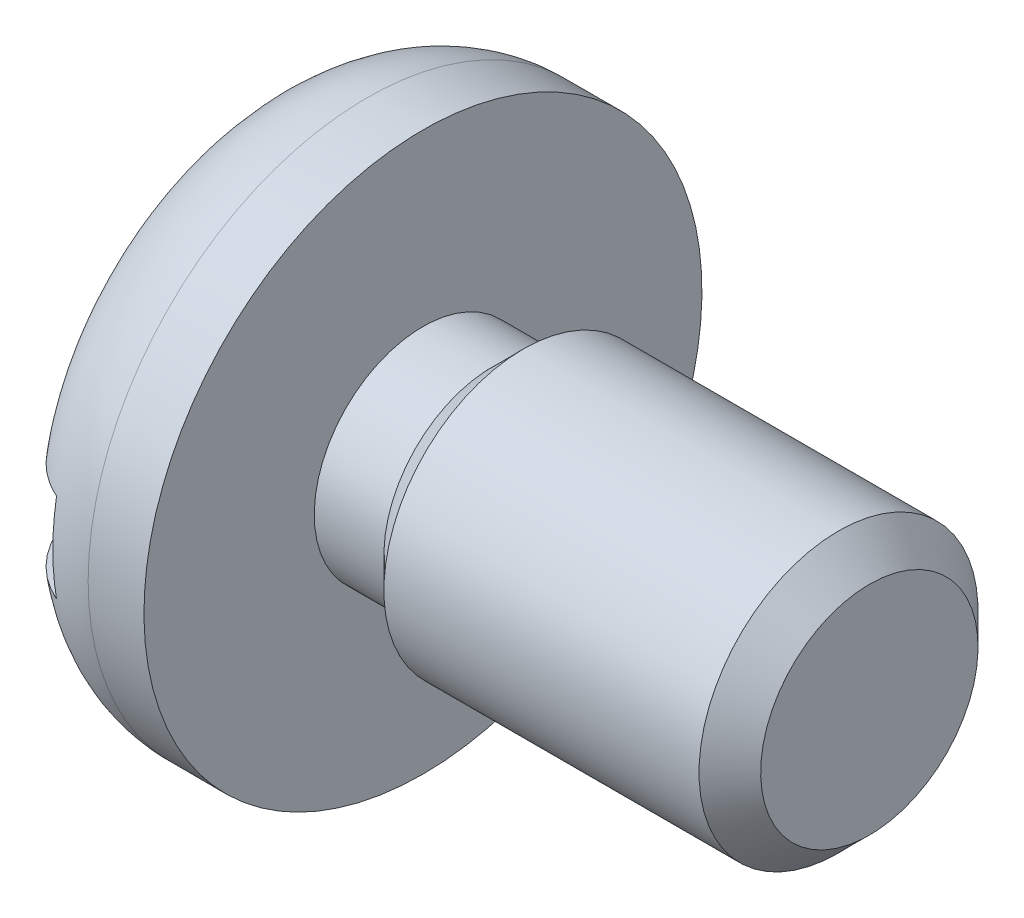
ISO-10303-21;
HEADER;
FILE_DESCRIPTION(('STEP AP214'),'2;1');
FILE_NAME('part.step','',(''),(''),'','','');
FILE_SCHEMA(('AUTOMOTIVE_DESIGN { 1 0 10303 214 1 1 1 1 }'));
ENDSEC;
DATA;
#1=APPLICATION_CONTEXT('core data for automotive mechanical design processes');
#2=APPLICATION_PROTOCOL_DEFINITION('international standard','automotive_design',2000,#1);
#3=PRODUCT_CONTEXT('',#1,'mechanical');
#4=PRODUCT('Part','Part','',(#3));
#5=PRODUCT_RELATED_PRODUCT_CATEGORY('part','',(#4));
#6=PRODUCT_DEFINITION_FORMATION('','',#4);
#7=PRODUCT_DEFINITION_CONTEXT('part definition',#1,'design');
#8=PRODUCT_DEFINITION('design','',#6,#7);
#9=PRODUCT_DEFINITION_SHAPE('','',#8);
#10=(LENGTH_UNIT() NAMED_UNIT(*) SI_UNIT(.MILLI.,.METRE.));
#11=(NAMED_UNIT(*) PLANE_ANGLE_UNIT() SI_UNIT($,.RADIAN.));
#12=(NAMED_UNIT(*) SI_UNIT($,.STERADIAN.) SOLID_ANGLE_UNIT());
#13=UNCERTAINTY_MEASURE_WITH_UNIT(LENGTH_MEASURE(1.E-05),#10,'distance_accuracy_value','');
#14=(GEOMETRIC_REPRESENTATION_CONTEXT(3) GLOBAL_UNCERTAINTY_ASSIGNED_CONTEXT((#13)) GLOBAL_UNIT_ASSIGNED_CONTEXT((#10,
#11,#12)) REPRESENTATION_CONTEXT('',''));
#15=CARTESIAN_POINT('',(0.,0.,0.));
#16=DIRECTION('',(0.,0.,1.));
#17=DIRECTION('',(1.,0.,0.));
#18=AXIS2_PLACEMENT_3D('',#15,#16,#17);
#19=CARTESIAN_POINT('',(0.761923750000008,0.,0.));
#20=DIRECTION('',(1.,0.,0.));
#21=DIRECTION('',(0.,1.,0.));
#22=AXIS2_PLACEMENT_3D('',#19,#20,#21);
#23=CONICAL_SURFACE('',#22,1.112,0.785121971591518);
#24=CARTESIAN_POINT('',(0.9,0.,0.));
#25=DIRECTION('',(1.,0.,0.));
#26=DIRECTION('',(0.,1.,0.));
#27=AXIS2_PLACEMENT_3D('',#24,#25,#26);
#28=CIRCLE('',#27,1.25);
#29=CARTESIAN_POINT('',(0.9,-1.25,0.));
#30=VERTEX_POINT('',#29);
#31=EDGE_CURVE('E150',#30,#30,#28,.T.);
#32=ORIENTED_EDGE('',*,*,#31,.F.);
#33=DIRECTION('',(-0.707302051313217,0.70691145712042,0.));
#34=VECTOR('',#33,1.);
#35=CARTESIAN_POINT('',(0.761923750000008,-1.112,0.));
#36=LINE('',#35,#34);
#37=CARTESIAN_POINT('',(0.623847500000008,-0.974,0.));
#38=VERTEX_POINT('',#37);
#39=EDGE_CURVE('E11',#30,#38,#36,.T.);
#40=ORIENTED_EDGE('',*,*,#39,.T.);
#41=CARTESIAN_POINT('',(0.623847500000008,0.,0.));
#42=DIRECTION('',(1.,0.,0.));
#43=DIRECTION('',(0.,1.,0.));
#44=AXIS2_PLACEMENT_3D('',#41,#42,#43);
#45=CIRCLE('',#44,0.974);
#46=EDGE_CURVE('E312',#38,#38,#45,.T.);
#47=ORIENTED_EDGE('',*,*,#46,.T.);
#48=ORIENTED_EDGE('',*,*,#39,.F.);
#49=EDGE_LOOP('',(#32,#40,#47,#48));
#50=FACE_BOUND('',#49,.T.);
#51=ADVANCED_FACE('F17',(#50),#23,.T.);
#52=CARTESIAN_POINT('',(0.311923750000005,0.,0.));
#53=DIRECTION('',(1.,0.,0.));
#54=DIRECTION('',(0.,1.,0.));
#55=AXIS2_PLACEMENT_3D('',#52,#53,#54);
#56=CYLINDRICAL_SURFACE('',#55,0.974);
#57=ORIENTED_EDGE('',*,*,#46,.F.);
#58=DIRECTION('',(-1.,0.,0.));
#59=VECTOR('',#58,1.);
#60=CARTESIAN_POINT('',(0.311923750000005,-0.974,0.));
#61=LINE('',#60,#59);
#62=CARTESIAN_POINT('',(0.,-0.974,0.));
#63=VERTEX_POINT('',#62);
#64=EDGE_CURVE('E28',#38,#63,#61,.T.);
#65=ORIENTED_EDGE('',*,*,#64,.T.);
#66=CARTESIAN_POINT('',(0.,0.,0.));
#67=DIRECTION('',(1.,0.,0.));
#68=DIRECTION('',(0.,1.,0.));
#69=AXIS2_PLACEMENT_3D('',#66,#67,#68);
#70=CIRCLE('',#69,0.974);
#71=EDGE_CURVE('E444',#63,#63,#70,.T.);
#72=ORIENTED_EDGE('',*,*,#71,.T.);
#73=ORIENTED_EDGE('',*,*,#64,.F.);
#74=EDGE_LOOP('',(#57,#65,#72,#73));
#75=FACE_BOUND('',#74,.T.);
#76=ADVANCED_FACE('F269',(#75),#56,.T.);
#77=CARTESIAN_POINT('',(0.,1.737,0.));
#78=DIRECTION('',(1.,0.,0.));
#79=DIRECTION('',(0.,1.,0.));
#80=AXIS2_PLACEMENT_3D('',#77,#78,#79);
#81=PLANE('',#80);
#82=ORIENTED_EDGE('',*,*,#71,.F.);
#83=EDGE_LOOP('',(#82));
#84=FACE_BOUND('',#83,.T.);
#85=CARTESIAN_POINT('',(0.,0.,0.));
#86=DIRECTION('',(1.,0.,0.));
#87=DIRECTION('',(0.,1.,0.));
#88=AXIS2_PLACEMENT_3D('',#85,#86,#87);
#89=CIRCLE('',#88,2.5);
#90=CARTESIAN_POINT('',(0.,-2.5,0.));
#91=VERTEX_POINT('',#90);
#92=EDGE_CURVE('E302',#91,#91,#89,.T.);
#93=ORIENTED_EDGE('',*,*,#92,.T.);
#94=EDGE_LOOP('',(#93));
#95=FACE_BOUND('',#94,.T.);
#96=ADVANCED_FACE('F274',(#84,#95),#81,.T.);
#97=CARTESIAN_POINT('',(-0.75,0.,0.));
#98=DIRECTION('',(1.,0.,0.));
#99=DIRECTION('',(0.,1.,0.));
#100=AXIS2_PLACEMENT_3D('',#97,#98,#99);
#101=CONICAL_SURFACE('',#100,2.49986910030477,0.000174532924896676);
#102=ORIENTED_EDGE('',*,*,#92,.F.);
#103=DIRECTION('',(-0.999999984769129,0.000174532924314086,0.));
#104=VECTOR('',#103,1.);
#105=CARTESIAN_POINT('',(-0.75,-2.49986910030477,0.));
#106=LINE('',#105,#104);
#107=CARTESIAN_POINT('',(-0.500174532923859,-2.49991270307477,0.));
#108=VERTEX_POINT('',#107);
#109=EDGE_CURVE('E85',#91,#108,#106,.T.);
#110=ORIENTED_EDGE('',*,*,#109,.T.);
#111=CARTESIAN_POINT('',(-0.500174532923859,0.,0.));
#112=DIRECTION('',(-1.,0.,0.));
#113=DIRECTION('',(0.,-1.,0.));
#114=AXIS2_PLACEMENT_3D('',#111,#112,#113);
#115=CIRCLE('',#114,2.49991270307477);
#116=CARTESIAN_POINT('',(-0.500174532923859,0.,2.49991270307477));
#117=VERTEX_POINT('',#116);
#118=EDGE_CURVE('E233',#117,#108,#115,.T.);
#119=ORIENTED_EDGE('',*,*,#118,.F.);
#120=CARTESIAN_POINT('',(-0.500174532923859,0.,0.));
#121=DIRECTION('',(-1.,0.,0.));
#122=DIRECTION('',(0.,-1.,0.));
#123=AXIS2_PLACEMENT_3D('',#120,#121,#122);
#124=CIRCLE('',#123,2.49991270307477);
#125=EDGE_CURVE('E303',#108,#117,#124,.T.);
#126=ORIENTED_EDGE('',*,*,#125,.F.);
#127=ORIENTED_EDGE('',*,*,#109,.F.);
#128=EDGE_LOOP('',(#102,#110,#119,#126,#127));
#129=FACE_BOUND('',#128,.T.);
#130=ADVANCED_FACE('F172',(#129),#101,.T.);
#131=CARTESIAN_POINT('',(-0.499999999999545,0.,0.));
#132=DIRECTION('',(1.,0.,0.));
#133=DIRECTION('',(0.,0.,-1.));
#134=AXIS2_PLACEMENT_3D('',#131,#132,#133);
#135=TOROIDAL_SURFACE('',#134,1.49991271830564,1.);
#136=ORIENTED_EDGE('',*,*,#118,.T.);
#137=ORIENTED_EDGE('',*,*,#125,.T.);
#138=CARTESIAN_POINT('',(-0.499999999999545,0.,1.49991271830564));
#139=DIRECTION('',(0.,-1.,0.));
#140=DIRECTION('',(0.,0.,1.));
#141=AXIS2_PLACEMENT_3D('',#138,#139,#140);
#142=CIRCLE('',#141,1.);
#143=CARTESIAN_POINT('',(-0.9,0.,2.41642785729661));
#144=VERTEX_POINT('',#143);
#145=EDGE_CURVE('E98',#117,#144,#142,.T.);
#146=ORIENTED_EDGE('',*,*,#145,.T.);
#147=CARTESIAN_POINT('',(-0.9,0.,0.));
#148=DIRECTION('',(1.,0.,0.));
#149=DIRECTION('',(0.,0.,-1.));
#150=AXIS2_PLACEMENT_3D('',#147,#148,#149);
#151=CIRCLE('',#150,2.41642785729661);
#152=CARTESIAN_POINT('',(-0.9,-0.400000000000008,2.38309118363505));
#153=VERTEX_POINT('',#152);
#154=EDGE_CURVE('E124',#144,#153,#151,.T.);
#155=ORIENTED_EDGE('',*,*,#154,.T.);
#156=CARTESIAN_POINT('',(-0.899999999999997,-0.400000000000006,2.38309118363505));
#157=CARTESIAN_POINT('',(-0.913359692773829,-0.399999972156727,2.37717923492746));
#158=CARTESIAN_POINT('',(-0.926588468523627,-0.399999400001929,2.37097159477283));
#159=CARTESIAN_POINT('',(-0.952621333972014,-0.399997873409322,2.35804681311801));
#160=CARTESIAN_POINT('',(-0.965428428408997,-0.399996923059351,2.35133572327939));
#161=CARTESIAN_POINT('',(-0.990603230709646,-0.399995325129803,2.33743489557238));
#162=CARTESIAN_POINT('',(-1.00297415722731,-0.399994674447371,2.33025098602836));
#163=CARTESIAN_POINT('',(-1.02726411888355,-0.399994136987938,2.31543564549942));
#164=CARTESIAN_POINT('',(-1.03918656887102,-0.399994242127817,2.30780981251768));
#165=CARTESIAN_POINT('',(-1.06256897928554,-0.399995525912785,2.29214151656593));
#166=CARTESIAN_POINT('',(-1.07403253576308,-0.399996692994703,2.28410441947884));
#167=CARTESIAN_POINT('',(-1.09648845775742,-0.400000264626653,2.26764425374697));
#168=CARTESIAN_POINT('',(-1.10748458532212,-0.400002655617621,2.25922631688603));
#169=CARTESIAN_POINT('',(-1.12899875685097,-0.400008716606858,2.24203477412172));
#170=CARTESIAN_POINT('',(-1.13952071426327,-0.40001237233072,2.23326606506689));
#171=CARTESIAN_POINT('',(-1.16008139042071,-0.400020900110418,2.21540284410562));
#172=CARTESIAN_POINT('',(-1.17012415983333,-0.400025758301967,2.20631299396987));
#173=CARTESIAN_POINT('',(-1.18972296380739,-0.400036543021896,2.18783683847583));
#174=CARTESIAN_POINT('',(-1.19928317255858,-0.400042457053854,2.17845496038888));
#175=CARTESIAN_POINT('',(-1.21791493880761,-0.400055138047988,2.15942350549002));
#176=CARTESIAN_POINT('',(-1.22699078079512,-0.400061894676555,2.14977812265695));
#177=CARTESIAN_POINT('',(-1.24465339615268,-0.400075995259758,2.13024775747796));
#178=CARTESIAN_POINT('',(-1.25324455156939,-0.400083331677078,2.12036673759948));
#179=CARTESIAN_POINT('',(-1.26993879399434,-0.400098292352019,2.10039248112391));
#180=CARTESIAN_POINT('',(-1.27804634833831,-0.400105912343787,2.09030297778084));
#181=CARTESIAN_POINT('',(-1.29377572452708,-0.40012112216634,2.06993836820522));
#182=CARTESIAN_POINT('',(-1.30140208719783,-0.400128711322983,2.05966676877833));
#183=CARTESIAN_POINT('',(-1.31617266980289,-0.400143537303015,2.03896376575353));
#184=CARTESIAN_POINT('',(-1.32332149271493,-0.400150777213205,2.02853564569991));
#185=CARTESIAN_POINT('',(-1.33714175795974,-0.400164591632531,2.00754454501751));
#186=CARTESIAN_POINT('',(-1.3438178545341,-0.400171173011847,1.9969846282403));
#187=CARTESIAN_POINT('',(-1.356698520926,-0.400183378576343,1.9757539884457));
#188=CARTESIAN_POINT('',(-1.36290778580071,-0.40018901329524,1.96508611350173));
#189=CARTESIAN_POINT('',(-1.37486165459034,-0.400199066062875,1.94366269390891));
#190=CARTESIAN_POINT('',(-1.38061098435823,-0.400203498051504,1.93290978578405));
#191=CARTESIAN_POINT('',(-1.39165278233399,-0.400210928103313,1.9113384953502));
#192=CARTESIAN_POINT('',(-1.39694999758815,-0.400213943122614,1.90052254253037));
#193=CARTESIAN_POINT('',(-1.40709622273705,-0.400218372965709,1.87884639903023));
#194=CARTESIAN_POINT('',(-1.4119499916754,-0.40021980724445,1.8679884355798));
#195=CARTESIAN_POINT('',(-1.42121876218764,-0.400220967958586,1.84624853454383));
#196=CARTESIAN_POINT('',(-1.42563852600258,-0.40022071570812,1.83536862694262));
#197=CARTESIAN_POINT('',(-1.43404943303918,-0.400218460859977,1.81360411970606));
#198=CARTESIAN_POINT('',(-1.43804533328588,-0.40021648067921,1.8027213580425));
#199=CARTESIAN_POINT('',(-1.44561929789401,-0.400210798067553,1.78096943866903));
#200=CARTESIAN_POINT('',(-1.44920210602819,-0.400207118288364,1.77010193234785));
#201=CARTESIAN_POINT('',(-1.45596124047925,-0.400198139517158,1.74839783167193));
#202=CARTESIAN_POINT('',(-1.45914228964972,-0.400192862438532,1.73756270774869));
#203=CARTESIAN_POINT('',(-1.46510976364962,-0.400180870624603,1.71593969835958));
#204=CARTESIAN_POINT('',(-1.46790088310567,-0.400174175988501,1.70515310811298));
#205=CARTESIAN_POINT('',(-1.47310079447315,-0.400159610837252,1.68364250372229));
#206=CARTESIAN_POINT('',(-1.47551424583723,-0.400151757446241,1.67291961566308));
#207=CARTESIAN_POINT('',(-1.47997149816383,-0.400135220905452,1.65155082289181));
#208=CARTESIAN_POINT('',(-1.48201991677823,-0.400126550619488,1.64090588067998));
#209=CARTESIAN_POINT('',(-1.48576009572105,-0.400108801822924,1.61970628857092));
#210=CARTESIAN_POINT('',(-1.48745642571187,-0.400099730678928,1.60915244573965));
#211=CARTESIAN_POINT('',(-1.49050570509936,-0.400081711930572,1.58814793540693));
#212=CARTESIAN_POINT('',(-1.49186316994919,-0.400072764392691,1.57769791861862));
#213=CARTESIAN_POINT('',(-1.49541448988524,-0.400047066058998,1.54674545030525));
#214=CARTESIAN_POINT('',(-1.49716603687215,-0.400031039497288,1.52619063700259));
#215=CARTESIAN_POINT('',(-1.49944205763639,-0.400007839392497,1.48561921466085));
#216=CARTESIAN_POINT('',(-1.50000107734696,-0.400000419536353,1.46560453960563));
#217=CARTESIAN_POINT('',(-1.49999999999955,-0.4,1.44559266826275));
#218=B_SPLINE_CURVE_WITH_KNOTS('',3,(#156,#157,#158,#159,#160,#161,#162,#163,#164,#165,#166,
#167,#168,#169,#170,#171,#172,#173,#174,#175,#176,#177,#178,#179,#180,#181,#182,#183,#184,#185,
#186,#187,#188,#189,#190,#191,#192,#193,#194,#195,#196,#197,#198,#199,#200,#201,#202,#203,#204,
#205,#206,#207,#208,#209,#210,#211,#212,#213,#214,#215,#216,#217),.UNSPECIFIED.,.F.,.F.,(4,2,2,
2,2,2,2,2,2,2,2,2,2,2,2,2,2,2,2,2,2,2,2,2,2,2,2,2,2,2,4),(0.,0.0438243158808445,
0.0871872778317475,0.130090550680382,0.172535683666369,0.214524103834433,0.256057111104363,
0.297135874973468,0.337761432788623,0.377934689509098,0.417656418868079,0.456927265830229,
0.495747750234597,0.534118271506672,0.572039114320124,0.609510455087718,0.646532369161737,
0.68310483862684,0.719227760572386,0.754900955736669,0.790124177421957,0.824897120586587,
0.859219431028387,0.893090714582171,0.926510546262888,0.959478479294984,0.991994053977551,
1.02405680634378,1.05566627658198,1.11751705018244,1.17755029425228),.UNSPECIFIED.);
#219=CARTESIAN_POINT('',(-1.5,-0.400000000000007,1.44559266826275));
#220=VERTEX_POINT('',#219);
#221=EDGE_CURVE('E142',#153,#220,#218,.T.);
#222=ORIENTED_EDGE('',*,*,#221,.T.);
#223=CARTESIAN_POINT('',(-1.5,0.,0.));
#224=DIRECTION('',(1.,0.,0.));
#225=DIRECTION('',(0.,-1.,0.));
#226=AXIS2_PLACEMENT_3D('',#223,#224,#225);
#227=CIRCLE('',#226,1.49991271830564);
#228=CARTESIAN_POINT('',(-1.5,-0.4,-1.44559266826275));
#229=VERTEX_POINT('',#228);
#230=EDGE_CURVE('E132',#220,#229,#227,.T.);
#231=ORIENTED_EDGE('',*,*,#230,.T.);
#232=CARTESIAN_POINT('',(-1.49999999999955,-0.399999999999993,-1.44559266826275));
#233=CARTESIAN_POINT('',(-1.50000107734696,-0.400000419536346,-1.46560453960563));
#234=CARTESIAN_POINT('',(-1.49944205763639,-0.40000783939249,-1.48561921466085));
#235=CARTESIAN_POINT('',(-1.49716603687215,-0.400031039497282,-1.52619063700259));
#236=CARTESIAN_POINT('',(-1.49541448988524,-0.400047066058992,-1.54674545030526));
#237=CARTESIAN_POINT('',(-1.49186316994919,-0.400072764392684,-1.57769791861862));
#238=CARTESIAN_POINT('',(-1.49050570509936,-0.400081711930565,-1.58814793540693));
#239=CARTESIAN_POINT('',(-1.48745642571187,-0.40009973067892,-1.60915244573965));
#240=CARTESIAN_POINT('',(-1.48576009572105,-0.400108801822917,-1.61970628857092));
#241=CARTESIAN_POINT('',(-1.48201991677823,-0.400126550619481,-1.64090588067998));
#242=CARTESIAN_POINT('',(-1.47997149816383,-0.400135220905445,-1.65155082289181));
#243=CARTESIAN_POINT('',(-1.47551424583723,-0.400151757446235,-1.67291961566308));
#244=CARTESIAN_POINT('',(-1.47310079447315,-0.400159610837247,-1.6836425037223));
#245=CARTESIAN_POINT('',(-1.46790088310567,-0.400174175988497,-1.70515310811299));
#246=CARTESIAN_POINT('',(-1.46510976364962,-0.400180870624598,-1.71593969835958));
#247=CARTESIAN_POINT('',(-1.45914228964972,-0.400192862438526,-1.7375627077487));
#248=CARTESIAN_POINT('',(-1.45596124047925,-0.400198139517152,-1.74839783167193));
#249=CARTESIAN_POINT('',(-1.44920210602819,-0.400207118288358,-1.77010193234785));
#250=CARTESIAN_POINT('',(-1.44561929789401,-0.400210798067548,-1.78096943866903));
#251=CARTESIAN_POINT('',(-1.43804533328588,-0.400216480679204,-1.8027213580425));
#252=CARTESIAN_POINT('',(-1.43404943303918,-0.40021846085997,-1.81360411970606));
#253=CARTESIAN_POINT('',(-1.42563852600258,-0.400220715708113,-1.83536862694262));
#254=CARTESIAN_POINT('',(-1.42121876218764,-0.400220967958581,-1.84624853454383));
#255=CARTESIAN_POINT('',(-1.4119499916754,-0.400219807244446,-1.8679884355798));
#256=CARTESIAN_POINT('',(-1.40709622273705,-0.400218372965703,-1.87884639903023));
#257=CARTESIAN_POINT('',(-1.39694999758815,-0.400213943122607,-1.90052254253037));
#258=CARTESIAN_POINT('',(-1.39165278233399,-0.400210928103306,-1.9113384953502));
#259=CARTESIAN_POINT('',(-1.38061098435823,-0.400203498051498,-1.93290978578405));
#260=CARTESIAN_POINT('',(-1.37486165459034,-0.400199066062869,-1.94366269390892));
#261=CARTESIAN_POINT('',(-1.36290778580071,-0.400189013295234,-1.96508611350173));
#262=CARTESIAN_POINT('',(-1.356698520926,-0.400183378576336,-1.9757539884457));
#263=CARTESIAN_POINT('',(-1.3438178545341,-0.400171173011841,-1.9969846282403));
#264=CARTESIAN_POINT('',(-1.33714175795974,-0.400164591632524,-2.00754454501751));
#265=CARTESIAN_POINT('',(-1.32332149271493,-0.400150777213198,-2.02853564569991));
#266=CARTESIAN_POINT('',(-1.31617266980289,-0.400143537303009,-2.03896376575353));
#267=CARTESIAN_POINT('',(-1.30140208719783,-0.400128711322978,-2.05966676877833));
#268=CARTESIAN_POINT('',(-1.29377572452708,-0.400121122166334,-2.06993836820522));
#269=CARTESIAN_POINT('',(-1.27804634833831,-0.400105912343781,-2.09030297778084));
#270=CARTESIAN_POINT('',(-1.26993879399434,-0.400098292352012,-2.10039248112391));
#271=CARTESIAN_POINT('',(-1.25324455156939,-0.400083331677071,-2.12036673759948));
#272=CARTESIAN_POINT('',(-1.24465339615268,-0.400075995259753,-2.13024775747796));
#273=CARTESIAN_POINT('',(-1.22699078079512,-0.400061894676549,-2.14977812265695));
#274=CARTESIAN_POINT('',(-1.21791493880761,-0.40005513804798,-2.15942350549002));
#275=CARTESIAN_POINT('',(-1.19928317255858,-0.400042457053846,-2.17845496038888));
#276=CARTESIAN_POINT('',(-1.18972296380739,-0.400036543021888,-2.18783683847583));
#277=CARTESIAN_POINT('',(-1.17012415983333,-0.400025758301959,-2.20631299396987));
#278=CARTESIAN_POINT('',(-1.16008139042071,-0.400020900110409,-2.21540284410562));
#279=CARTESIAN_POINT('',(-1.13952071426327,-0.40001237233071,-2.23326606506689));
#280=CARTESIAN_POINT('',(-1.12899875685097,-0.400008716606849,-2.24203477412172));
#281=CARTESIAN_POINT('',(-1.10748458532212,-0.400002655617612,-2.25922631688603));
#282=CARTESIAN_POINT('',(-1.09648845775742,-0.400000264626644,-2.26764425374697));
#283=CARTESIAN_POINT('',(-1.07403253576308,-0.399996692994693,-2.28410441947884));
#284=CARTESIAN_POINT('',(-1.06256897928554,-0.399995525912775,-2.29214151656594));
#285=CARTESIAN_POINT('',(-1.03918656887102,-0.399994242127806,-2.30780981251769));
#286=CARTESIAN_POINT('',(-1.02726411888355,-0.399994136987924,-2.31543564549942));
#287=CARTESIAN_POINT('',(-1.00297415722731,-0.399994674447357,-2.33025098602836));
#288=CARTESIAN_POINT('',(-0.990603230709647,-0.399995325129791,-2.33743489557238));
#289=CARTESIAN_POINT('',(-0.965428428408998,-0.399996923059339,-2.35133572327939));
#290=CARTESIAN_POINT('',(-0.952621333972015,-0.39999787340931,-2.35804681311801));
#291=CARTESIAN_POINT('',(-0.926588468523628,-0.399999400001915,-2.37097159477284));
#292=CARTESIAN_POINT('',(-0.913359692773831,-0.399999972156713,-2.37717923492746));
#293=CARTESIAN_POINT('',(-0.899999999999999,-0.399999999999993,-2.38309118363505));
#294=B_SPLINE_CURVE_WITH_KNOTS('',3,(#232,#233,#234,#235,#236,#237,#238,#239,#240,#241,#242,
#243,#244,#245,#246,#247,#248,#249,#250,#251,#252,#253,#254,#255,#256,#257,#258,#259,#260,#261,
#262,#263,#264,#265,#266,#267,#268,#269,#270,#271,#272,#273,#274,#275,#276,#277,#278,#279,#280,
#281,#282,#283,#284,#285,#286,#287,#288,#289,#290,#291,#292,#293),.UNSPECIFIED.,.F.,.F.,(4,2,2,
2,2,2,2,2,2,2,2,2,2,2,2,2,2,2,2,2,2,2,2,2,2,2,2,2,2,2,4),(0.,0.0600332440698376,0.1218840176703,
0.153493487908503,0.185556240274731,0.218071814957298,0.251039747989393,0.28445957967011,
0.318330863223894,0.352653173665694,0.387426116830324,0.422649338515612,0.458322533679895,
0.494445455625441,0.531017925090544,0.568039839164563,0.605511179932157,0.643432022745608,
0.681802544017683,0.720623028422052,0.759893875384201,0.799615604743183,0.839788861463657,
0.880414419278812,0.921493183147917,0.963026190417848,1.00501461058591,1.0474597435719,
1.09036301642053,1.13372597837144,1.17755029425228),.UNSPECIFIED.);
#295=CARTESIAN_POINT('',(-0.9,-0.4,-2.38309118363505));
#296=VERTEX_POINT('',#295);
#297=EDGE_CURVE('E128',#229,#296,#294,.T.);
#298=ORIENTED_EDGE('',*,*,#297,.T.);
#299=CARTESIAN_POINT('',(-0.9,0.,0.));
#300=DIRECTION('',(1.,0.,0.));
#301=DIRECTION('',(0.,0.,-1.));
#302=AXIS2_PLACEMENT_3D('',#299,#300,#301);
#303=CIRCLE('',#302,2.41642785729661);
#304=CARTESIAN_POINT('',(-0.9,0.4,-2.38309118363505));
#305=VERTEX_POINT('',#304);
#306=EDGE_CURVE('E112',#296,#305,#303,.T.);
#307=ORIENTED_EDGE('',*,*,#306,.T.);
#308=CARTESIAN_POINT('',(-0.899999999999998,0.399999999999995,-2.38309118363505));
#309=CARTESIAN_POINT('',(-0.91335969277383,0.399999972156715,-2.37717923492746));
#310=CARTESIAN_POINT('',(-0.926588468523627,0.399999400001917,-2.37097159477284));
#311=CARTESIAN_POINT('',(-0.952621333972014,0.399997873409312,-2.35804681311801));
#312=CARTESIAN_POINT('',(-0.965428428408997,0.39999692305934,-2.35133572327939));
#313=CARTESIAN_POINT('',(-0.990603230709646,0.399995325129793,-2.33743489557238));
#314=CARTESIAN_POINT('',(-1.00297415722731,0.39999467444736,-2.33025098602837));
#315=CARTESIAN_POINT('',(-1.02726411888355,0.399994136987927,-2.31543564549942));
#316=CARTESIAN_POINT('',(-1.03918656887102,0.399994242127808,-2.30780981251769));
#317=CARTESIAN_POINT('',(-1.06256897928554,0.399995525912776,-2.29214151656594));
#318=CARTESIAN_POINT('',(-1.07403253576308,0.399996692994694,-2.28410441947884));
#319=CARTESIAN_POINT('',(-1.09648845775742,0.400000264626644,-2.26764425374697));
#320=CARTESIAN_POINT('',(-1.10748458532212,0.400002655617612,-2.25922631688603));
#321=CARTESIAN_POINT('',(-1.12899875685097,0.400008716606849,-2.24203477412172));
#322=CARTESIAN_POINT('',(-1.13952071426327,0.40001237233071,-2.23326606506689));
#323=CARTESIAN_POINT('',(-1.1600813904207,0.400020900110409,-2.21540284410563));
#324=CARTESIAN_POINT('',(-1.17012415983333,0.400025758301958,-2.20631299396988));
#325=CARTESIAN_POINT('',(-1.18972296380739,0.400036543021888,-2.18783683847583));
#326=CARTESIAN_POINT('',(-1.19928317255858,0.400042457053846,-2.17845496038888));
#327=CARTESIAN_POINT('',(-1.2179149388076,0.400055138047981,-2.15942350549003));
#328=CARTESIAN_POINT('',(-1.22699078079511,0.400061894676548,-2.14977812265696));
#329=CARTESIAN_POINT('',(-1.24465339615268,0.400075995259752,-2.13024775747796));
#330=CARTESIAN_POINT('',(-1.25324455156939,0.40008333167707,-2.12036673759948));
#331=CARTESIAN_POINT('',(-1.26993879399433,0.400098292352012,-2.10039248112392));
#332=CARTESIAN_POINT('',(-1.2780463483383,0.40010591234378,-2.09030297778084));
#333=CARTESIAN_POINT('',(-1.29377572452708,0.400121122166333,-2.06993836820522));
#334=CARTESIAN_POINT('',(-1.30140208719783,0.400128711322977,-2.05966676877833));
#335=CARTESIAN_POINT('',(-1.31617266980289,0.400143537303009,-2.03896376575354));
#336=CARTESIAN_POINT('',(-1.32332149271493,0.400150777213198,-2.02853564569991));
#337=CARTESIAN_POINT('',(-1.33714175795974,0.400164591632524,-2.00754454501751));
#338=CARTESIAN_POINT('',(-1.3438178545341,0.400171173011841,-1.9969846282403));
#339=CARTESIAN_POINT('',(-1.356698520926,0.400183378576337,-1.9757539884457));
#340=CARTESIAN_POINT('',(-1.36290778580071,0.400189013295235,-1.96508611350173));
#341=CARTESIAN_POINT('',(-1.37486165459034,0.40019906606287,-1.94366269390892));
#342=CARTESIAN_POINT('',(-1.38061098435823,0.400203498051499,-1.93290978578406));
#343=CARTESIAN_POINT('',(-1.39165278233398,0.400210928103308,-1.9113384953502));
#344=CARTESIAN_POINT('',(-1.39694999758815,0.400213943122608,-1.90052254253037));
#345=CARTESIAN_POINT('',(-1.40709622273704,0.400218372965704,-1.87884639903024));
#346=CARTESIAN_POINT('',(-1.4119499916754,0.400219807244446,-1.86798843557981));
#347=CARTESIAN_POINT('',(-1.42121876218764,0.400220967958582,-1.84624853454384));
#348=CARTESIAN_POINT('',(-1.42563852600258,0.400220715708115,-1.83536862694262));
#349=CARTESIAN_POINT('',(-1.43404943303917,0.400218460859973,-1.81360411970607));
#350=CARTESIAN_POINT('',(-1.43804533328588,0.400216480679205,-1.80272135804251));
#351=CARTESIAN_POINT('',(-1.44561929789401,0.400210798067549,-1.78096943866903));
#352=CARTESIAN_POINT('',(-1.44920210602819,0.40020711828836,-1.77010193234785));
#353=CARTESIAN_POINT('',(-1.45596124047925,0.400198139517153,-1.74839783167193));
#354=CARTESIAN_POINT('',(-1.45914228964972,0.400192862438528,-1.7375627077487));
#355=CARTESIAN_POINT('',(-1.46510976364962,0.400180870624599,-1.71593969835958));
#356=CARTESIAN_POINT('',(-1.46790088310567,0.400174175988498,-1.70515310811299));
#357=CARTESIAN_POINT('',(-1.47310079447315,0.400159610837248,-1.6836425037223));
#358=CARTESIAN_POINT('',(-1.47551424583723,0.400151757446238,-1.67291961566308));
#359=CARTESIAN_POINT('',(-1.47997149816383,0.400135220905449,-1.65155082289181));
#360=CARTESIAN_POINT('',(-1.48201991677823,0.400126550619485,-1.64090588067999));
#361=CARTESIAN_POINT('',(-1.48576009572105,0.400108801822921,-1.61970628857092));
#362=CARTESIAN_POINT('',(-1.48745642571187,0.400099730678924,-1.60915244573965));
#363=CARTESIAN_POINT('',(-1.49050570509936,0.400081711930569,-1.58814793540693));
#364=CARTESIAN_POINT('',(-1.49186316994919,0.400072764392688,-1.57769791861862));
#365=CARTESIAN_POINT('',(-1.49541448988524,0.400047066058995,-1.54674545030526));
#366=CARTESIAN_POINT('',(-1.49716603687215,0.400031039497285,-1.52619063700259));
#367=CARTESIAN_POINT('',(-1.49944205763639,0.400007839392494,-1.48561921466085));
#368=CARTESIAN_POINT('',(-1.50000107734696,0.40000041953635,-1.46560453960563));
#369=CARTESIAN_POINT('',(-1.49999999999955,0.399999999999997,-1.44559266826275));
#370=B_SPLINE_CURVE_WITH_KNOTS('',3,(#308,#309,#310,#311,#312,#313,#314,#315,#316,#317,#318,
#319,#320,#321,#322,#323,#324,#325,#326,#327,#328,#329,#330,#331,#332,#333,#334,#335,#336,#337,
#338,#339,#340,#341,#342,#343,#344,#345,#346,#347,#348,#349,#350,#351,#352,#353,#354,#355,#356,
#357,#358,#359,#360,#361,#362,#363,#364,#365,#366,#367,#368,#369),.UNSPECIFIED.,.F.,.F.,(4,2,2,
2,2,2,2,2,2,2,2,2,2,2,2,2,2,2,2,2,2,2,2,2,2,2,2,2,2,2,4),(0.,0.0438243158808442,
0.0871872778317469,0.130090550680381,0.172535683666367,0.214524103834431,0.256057111104362,
0.297135874973466,0.337761432788621,0.377934689509095,0.417656418868076,0.456927265830226,
0.495747750234594,0.53411827150667,0.572039114320121,0.609510455087715,0.646532369161734,
0.683104838626837,0.719227760572383,0.754900955736667,0.790124177421954,0.824897120586584,
0.859219431028385,0.893090714582169,0.926510546262886,0.959478479294982,0.991994053977549,
1.02405680634378,1.05566627658198,1.11751705018244,1.17755029425228),.UNSPECIFIED.);
#371=CARTESIAN_POINT('',(-1.5,0.4,-1.44559266826275));
#372=VERTEX_POINT('',#371);
#373=EDGE_CURVE('E243',#305,#372,#370,.T.);
#374=ORIENTED_EDGE('',*,*,#373,.T.);
#375=CARTESIAN_POINT('',(-1.5,0.,0.));
#376=DIRECTION('',(1.,0.,0.));
#377=DIRECTION('',(0.,-1.,0.));
#378=AXIS2_PLACEMENT_3D('',#375,#376,#377);
#379=CIRCLE('',#378,1.49991271830564);
#380=CARTESIAN_POINT('',(-1.5,0.400000000000007,1.44559266826275));
#381=VERTEX_POINT('',#380);
#382=EDGE_CURVE('E222',#372,#381,#379,.T.);
#383=ORIENTED_EDGE('',*,*,#382,.T.);
#384=CARTESIAN_POINT('',(-1.49999999999955,0.400000000000002,1.44559266826275));
#385=CARTESIAN_POINT('',(-1.50000107734696,0.400000419536356,1.46560453960563));
#386=CARTESIAN_POINT('',(-1.49944205763639,0.4000078393925,1.48561921466085));
#387=CARTESIAN_POINT('',(-1.49716603687215,0.400031039497291,1.52619063700259));
#388=CARTESIAN_POINT('',(-1.49541448988524,0.400047066059001,1.54674545030526));
#389=CARTESIAN_POINT('',(-1.49186316994919,0.400072764392694,1.57769791861862));
#390=CARTESIAN_POINT('',(-1.49050570509936,0.400081711930576,1.58814793540693));
#391=CARTESIAN_POINT('',(-1.48745642571187,0.400099730678931,1.60915244573965));
#392=CARTESIAN_POINT('',(-1.48576009572105,0.400108801822927,1.61970628857092));
#393=CARTESIAN_POINT('',(-1.48201991677822,0.400126550619491,1.64090588067999));
#394=CARTESIAN_POINT('',(-1.47997149816383,0.400135220905455,1.65155082289181));
#395=CARTESIAN_POINT('',(-1.47551424583723,0.400151757446245,1.67291961566308));
#396=CARTESIAN_POINT('',(-1.47310079447315,0.400159610837255,1.6836425037223));
#397=CARTESIAN_POINT('',(-1.46790088310567,0.400174175988505,1.70515310811299));
#398=CARTESIAN_POINT('',(-1.46510976364962,0.400180870624606,1.71593969835958));
#399=CARTESIAN_POINT('',(-1.45914228964972,0.400192862438535,1.7375627077487));
#400=CARTESIAN_POINT('',(-1.45596124047925,0.40019813951716,1.74839783167194));
#401=CARTESIAN_POINT('',(-1.44920210602818,0.400207118288366,1.77010193234786));
#402=CARTESIAN_POINT('',(-1.445619297894,0.400210798067555,1.78096943866903));
#403=CARTESIAN_POINT('',(-1.43804533328588,0.400216480679212,1.80272135804251));
#404=CARTESIAN_POINT('',(-1.43404943303917,0.400218460859979,1.81360411970607));
#405=CARTESIAN_POINT('',(-1.42563852600258,0.400220715708122,1.83536862694262));
#406=CARTESIAN_POINT('',(-1.42121876218764,0.400220967958588,1.84624853454384));
#407=CARTESIAN_POINT('',(-1.4119499916754,0.400219807244452,1.86798843557981));
#408=CARTESIAN_POINT('',(-1.40709622273704,0.400218372965711,1.87884639903024));
#409=CARTESIAN_POINT('',(-1.39694999758814,0.400213943122615,1.90052254253037));
#410=CARTESIAN_POINT('',(-1.39165278233398,0.400210928103314,1.91133849535021));
#411=CARTESIAN_POINT('',(-1.38061098435823,0.400203498051506,1.93290978578406));
#412=CARTESIAN_POINT('',(-1.37486165459034,0.400199066062877,1.94366269390892));
#413=CARTESIAN_POINT('',(-1.36290778580071,0.400189013295242,1.96508611350174));
#414=CARTESIAN_POINT('',(-1.356698520926,0.400183378576345,1.9757539884457));
#415=CARTESIAN_POINT('',(-1.3438178545341,0.400171173011848,1.99698462824031));
#416=CARTESIAN_POINT('',(-1.33714175795974,0.400164591632531,2.00754454501751));
#417=CARTESIAN_POINT('',(-1.32332149271492,0.400150777213204,2.02853564569991));
#418=CARTESIAN_POINT('',(-1.31617266980288,0.400143537303015,2.03896376575354));
#419=CARTESIAN_POINT('',(-1.30140208719783,0.400128711322984,2.05966676877833));
#420=CARTESIAN_POINT('',(-1.29377572452708,0.400121122166341,2.06993836820523));
#421=CARTESIAN_POINT('',(-1.2780463483383,0.400105912343787,2.09030297778085));
#422=CARTESIAN_POINT('',(-1.26993879399433,0.400098292352018,2.10039248112392));
#423=CARTESIAN_POINT('',(-1.25324455156939,0.400083331677076,2.12036673759949));
#424=CARTESIAN_POINT('',(-1.24465339615268,0.400075995259757,2.13024775747796));
#425=CARTESIAN_POINT('',(-1.22699078079511,0.400061894676554,2.14977812265696));
#426=CARTESIAN_POINT('',(-1.2179149388076,0.400055138047986,2.15942350549003));
#427=CARTESIAN_POINT('',(-1.19928317255858,0.400042457053851,2.17845496038888));
#428=CARTESIAN_POINT('',(-1.18972296380739,0.400036543021893,2.18783683847583));
#429=CARTESIAN_POINT('',(-1.17012415983333,0.400025758301963,2.20631299396988));
#430=CARTESIAN_POINT('',(-1.1600813904207,0.400020900110413,2.21540284410563));
#431=CARTESIAN_POINT('',(-1.13952071426327,0.400012372330715,2.23326606506689));
#432=CARTESIAN_POINT('',(-1.12899875685096,0.400008716606855,2.24203477412172));
#433=CARTESIAN_POINT('',(-1.10748458532212,0.400002655617617,2.25922631688603));
#434=CARTESIAN_POINT('',(-1.09648845775742,0.400000264626648,2.26764425374697));
#435=CARTESIAN_POINT('',(-1.07403253576308,0.399996692994698,2.28410441947884));
#436=CARTESIAN_POINT('',(-1.06256897928554,0.399995525912781,2.29214151656594));
#437=CARTESIAN_POINT('',(-1.03918656887102,0.399994242127813,2.30780981251769));
#438=CARTESIAN_POINT('',(-1.02726411888355,0.399994136987931,2.31543564549942));
#439=CARTESIAN_POINT('',(-1.0029741572273,0.399994674447363,2.33025098602837));
#440=CARTESIAN_POINT('',(-0.990603230709644,0.399995325129797,2.33743489557239));
#441=CARTESIAN_POINT('',(-0.965428428408995,0.399996923059344,2.35133572327939));
#442=CARTESIAN_POINT('',(-0.952621333972013,0.399997873409315,2.35804681311801));
#443=CARTESIAN_POINT('',(-0.926588468523626,0.399999400001919,2.37097159477284));
#444=CARTESIAN_POINT('',(-0.913359692773829,0.399999972156716,2.37717923492746));
#445=CARTESIAN_POINT('',(-0.899999999999997,0.399999999999997,2.38309118363505));
#446=B_SPLINE_CURVE_WITH_KNOTS('',3,(#384,#385,#386,#387,#388,#389,#390,#391,#392,#393,#394,
#395,#396,#397,#398,#399,#400,#401,#402,#403,#404,#405,#406,#407,#408,#409,#410,#411,#412,#413,
#414,#415,#416,#417,#418,#419,#420,#421,#422,#423,#424,#425,#426,#427,#428,#429,#430,#431,#432,
#433,#434,#435,#436,#437,#438,#439,#440,#441,#442,#443,#444,#445),.UNSPECIFIED.,.F.,.F.,(4,2,2,
2,2,2,2,2,2,2,2,2,2,2,2,2,2,2,2,2,2,2,2,2,2,2,2,2,2,2,4),(0.,0.0600332440698395,
0.121884017670304,0.153493487908508,0.185556240274736,0.218071814957304,0.2510397479894,
0.284459579670117,0.318330863223902,0.352653173665703,0.387426116830333,0.422649338515621,
0.458322533679905,0.494445455625451,0.531017925090553,0.568039839164573,0.605511179932167,
0.643432022745618,0.681802544017693,0.720623028422061,0.759893875384211,0.799615604743192,
0.839788861463666,0.880414419278821,0.921493183147925,0.963026190417855,1.00501461058592,
1.0474597435719,1.09036301642054,1.13372597837144,1.17755029425228),.UNSPECIFIED.);
#447=CARTESIAN_POINT('',(-0.9,0.400000000000009,2.38309118363505));
#448=VERTEX_POINT('',#447);
#449=EDGE_CURVE('E244',#381,#448,#446,.T.);
#450=ORIENTED_EDGE('',*,*,#449,.T.);
#451=CARTESIAN_POINT('',(-0.9,0.,0.));
#452=DIRECTION('',(1.,0.,0.));
#453=DIRECTION('',(0.,0.,-1.));
#454=AXIS2_PLACEMENT_3D('',#451,#452,#453);
#455=CIRCLE('',#454,2.41642785729661);
#456=EDGE_CURVE('E125',#448,#144,#455,.T.);
#457=ORIENTED_EDGE('',*,*,#456,.T.);
#458=ORIENTED_EDGE('',*,*,#145,.F.);
#459=EDGE_LOOP('',(#136,#137,#146,#155,#222,#231,#298,#307,#374,#383,#450,#457,#458));
#460=FACE_BOUND('',#459,.T.);
#461=ADVANCED_FACE('F130',(#460),#135,.T.);
#462=CARTESIAN_POINT('',(-1.5,1.24986910030477,0.));
#463=DIRECTION('',(-1.,0.,0.));
#464=DIRECTION('',(0.,1.,0.));
#465=AXIS2_PLACEMENT_3D('',#462,#463,#464);
#466=PLANE('',#465);
#467=DIRECTION('',(0.,0.,-1.));
#468=VECTOR('',#467,1.);
#469=CARTESIAN_POINT('',(-1.5,-0.4,0.));
#470=LINE('',#469,#468);
#471=EDGE_CURVE('E138',#220,#229,#470,.T.);
#472=ORIENTED_EDGE('',*,*,#471,.T.);
#473=ORIENTED_EDGE('',*,*,#230,.F.);
#474=EDGE_LOOP('',(#472,#473));
#475=FACE_BOUND('',#474,.T.);
#476=ADVANCED_FACE('F171',(#475),#466,.T.);
#477=CARTESIAN_POINT('',(-1.5,1.24986910030477,0.));
#478=DIRECTION('',(-1.,0.,0.));
#479=DIRECTION('',(0.,1.,0.));
#480=AXIS2_PLACEMENT_3D('',#477,#478,#479);
#481=PLANE('',#480);
#482=DIRECTION('',(0.,0.,1.));
#483=VECTOR('',#482,1.);
#484=CARTESIAN_POINT('',(-1.5,0.4,0.));
#485=LINE('',#484,#483);
#486=EDGE_CURVE('E240',#372,#381,#485,.T.);
#487=ORIENTED_EDGE('',*,*,#486,.T.);
#488=ORIENTED_EDGE('',*,*,#382,.F.);
#489=EDGE_LOOP('',(#487,#488));
#490=FACE_BOUND('',#489,.T.);
#491=ADVANCED_FACE('F258',(#490),#481,.T.);
#492=CARTESIAN_POINT('',(-0.9,0.,0.));
#493=DIRECTION('',(1.,0.,0.));
#494=DIRECTION('',(0.,1.,0.));
#495=AXIS2_PLACEMENT_3D('',#492,#493,#494);
#496=PLANE('',#495);
#497=ORIENTED_EDGE('',*,*,#456,.F.);
#498=DIRECTION('',(0.,0.,-1.));
#499=VECTOR('',#498,1.);
#500=CARTESIAN_POINT('',(-0.9,0.4,-2.5));
#501=LINE('',#500,#499);
#502=EDGE_CURVE('E120',#448,#305,#501,.T.);
#503=ORIENTED_EDGE('',*,*,#502,.T.);
#504=ORIENTED_EDGE('',*,*,#306,.F.);
#505=DIRECTION('',(0.,0.,1.));
#506=VECTOR('',#505,1.);
#507=CARTESIAN_POINT('',(-0.9,-0.400000000000008,2.5));
#508=LINE('',#507,#506);
#509=EDGE_CURVE('E117',#296,#153,#508,.T.);
#510=ORIENTED_EDGE('',*,*,#509,.T.);
#511=ORIENTED_EDGE('',*,*,#154,.F.);
#512=EDGE_LOOP('',(#497,#503,#504,#510,#511));
#513=FACE_BOUND('',#512,.T.);
#514=ADVANCED_FACE('F114',(#513),#496,.F.);
#515=CARTESIAN_POINT('',(-1.5,0.4,0.));
#516=DIRECTION('',(0.,1.,0.));
#517=DIRECTION('',(0.,0.,-1.));
#518=AXIS2_PLACEMENT_3D('',#515,#516,#517);
#519=PLANE('',#518);
#520=ORIENTED_EDGE('',*,*,#449,.F.);
#521=ORIENTED_EDGE('',*,*,#486,.F.);
#522=ORIENTED_EDGE('',*,*,#373,.F.);
#523=ORIENTED_EDGE('',*,*,#502,.F.);
#524=EDGE_LOOP('',(#520,#521,#522,#523));
#525=FACE_BOUND('',#524,.T.);
#526=ADVANCED_FACE('F211',(#525),#519,.F.);
#527=CARTESIAN_POINT('',(-1.5,-0.4,0.));
#528=DIRECTION('',(0.,-1.,0.));
#529=DIRECTION('',(0.,0.,-1.));
#530=AXIS2_PLACEMENT_3D('',#527,#528,#529);
#531=PLANE('',#530);
#532=ORIENTED_EDGE('',*,*,#221,.F.);
#533=ORIENTED_EDGE('',*,*,#509,.F.);
#534=ORIENTED_EDGE('',*,*,#297,.F.);
#535=ORIENTED_EDGE('',*,*,#471,.F.);
#536=EDGE_LOOP('',(#532,#533,#534,#535));
#537=FACE_BOUND('',#536,.T.);
#538=ADVANCED_FACE('F141',(#537),#531,.F.);
#539=CARTESIAN_POINT('',(4.,0.625,0.));
#540=DIRECTION('',(1.,0.,0.));
#541=DIRECTION('',(0.,1.,0.));
#542=AXIS2_PLACEMENT_3D('',#539,#540,#541);
#543=PLANE('',#542);
#544=CARTESIAN_POINT('',(4.,0.,0.));
#545=DIRECTION('',(-1.,0.,0.));
#546=DIRECTION('',(0.,-1.,0.));
#547=AXIS2_PLACEMENT_3D('',#544,#545,#546);
#548=CIRCLE('',#547,0.9739475);
#549=CARTESIAN_POINT('',(4.,0.9739475,0.));
#550=VERTEX_POINT('',#549);
#551=EDGE_CURVE('E305',#550,#550,#548,.T.);
#552=ORIENTED_EDGE('',*,*,#551,.F.);
#553=EDGE_LOOP('',(#552));
#554=FACE_BOUND('',#553,.T.);
#555=ADVANCED_FACE('F210',(#554),#543,.T.);
#556=CARTESIAN_POINT('',(2.45,0.,0.));
#557=DIRECTION('',(1.,0.,0.));
#558=DIRECTION('',(0.,1.,0.));
#559=AXIS2_PLACEMENT_3D('',#556,#557,#558);
#560=CYLINDRICAL_SURFACE('',#559,1.25);
#561=CARTESIAN_POINT('',(3.7238475,0.,0.));
#562=DIRECTION('',(1.,0.,0.));
#563=DIRECTION('',(0.,-1.,0.));
#564=AXIS2_PLACEMENT_3D('',#561,#562,#563);
#565=CIRCLE('',#564,1.25);
#566=CARTESIAN_POINT('',(3.7238475,1.25,0.));
#567=VERTEX_POINT('',#566);
#568=CARTESIAN_POINT('',(3.7238475,-1.25,0.));
#569=VERTEX_POINT('',#568);
#570=EDGE_CURVE('E295',#567,#569,#565,.T.);
#571=ORIENTED_EDGE('',*,*,#570,.F.);
#572=CARTESIAN_POINT('',(3.7238475,0.,0.));
#573=DIRECTION('',(1.,0.,0.));
#574=DIRECTION('',(0.,-1.,0.));
#575=AXIS2_PLACEMENT_3D('',#572,#573,#574);
#576=CIRCLE('',#575,1.25);
#577=EDGE_CURVE('E288',#569,#567,#576,.T.);
#578=ORIENTED_EDGE('',*,*,#577,.F.);
#579=DIRECTION('',(-1.,0.,0.));
#580=VECTOR('',#579,1.);
#581=CARTESIAN_POINT('',(2.45,-1.25,0.));
#582=LINE('',#581,#580);
#583=EDGE_CURVE('E283',#569,#30,#582,.T.);
#584=ORIENTED_EDGE('',*,*,#583,.T.);
#585=ORIENTED_EDGE('',*,*,#31,.T.);
#586=ORIENTED_EDGE('',*,*,#583,.F.);
#587=EDGE_LOOP('',(#571,#578,#584,#585,#586));
#588=FACE_BOUND('',#587,.T.);
#589=ADVANCED_FACE('F19',(#588),#560,.T.);
#590=CARTESIAN_POINT('',(3.86192375,0.,0.));
#591=DIRECTION('',(-1.,0.,0.));
#592=DIRECTION('',(0.,-1.,0.));
#593=AXIS2_PLACEMENT_3D('',#590,#591,#592);
#594=CONICAL_SURFACE('',#593,1.11197375,0.78521707123257);
#595=ORIENTED_EDGE('',*,*,#551,.T.);
#596=DIRECTION('',(-0.707234821089091,0.706978718094881,0.));
#597=VECTOR('',#596,1.);
#598=CARTESIAN_POINT('',(3.86192375,1.11197375,0.));
#599=LINE('',#598,#597);
#600=EDGE_CURVE('E299',#550,#567,#599,.T.);
#601=ORIENTED_EDGE('',*,*,#600,.T.);
#602=ORIENTED_EDGE('',*,*,#570,.T.);
#603=ORIENTED_EDGE('',*,*,#577,.T.);
#604=ORIENTED_EDGE('',*,*,#600,.F.);
#605=EDGE_LOOP('',(#595,#601,#602,#603,#604));
#606=FACE_BOUND('',#605,.T.);
#607=ADVANCED_FACE('F174',(#606),#594,.T.);
#608=CLOSED_SHELL('',(#51,#76,#96,#130,#461,#476,#491,#514,#526,#538,#555,#589,#607));
#609=MANIFOLD_SOLID_BREP('B1',#608);
#610=ADVANCED_BREP_SHAPE_REPRESENTATION('',(#18,#609),#14);
#611=SHAPE_DEFINITION_REPRESENTATION(#9,#610);
ENDSEC;
END-ISO-10303-21;
